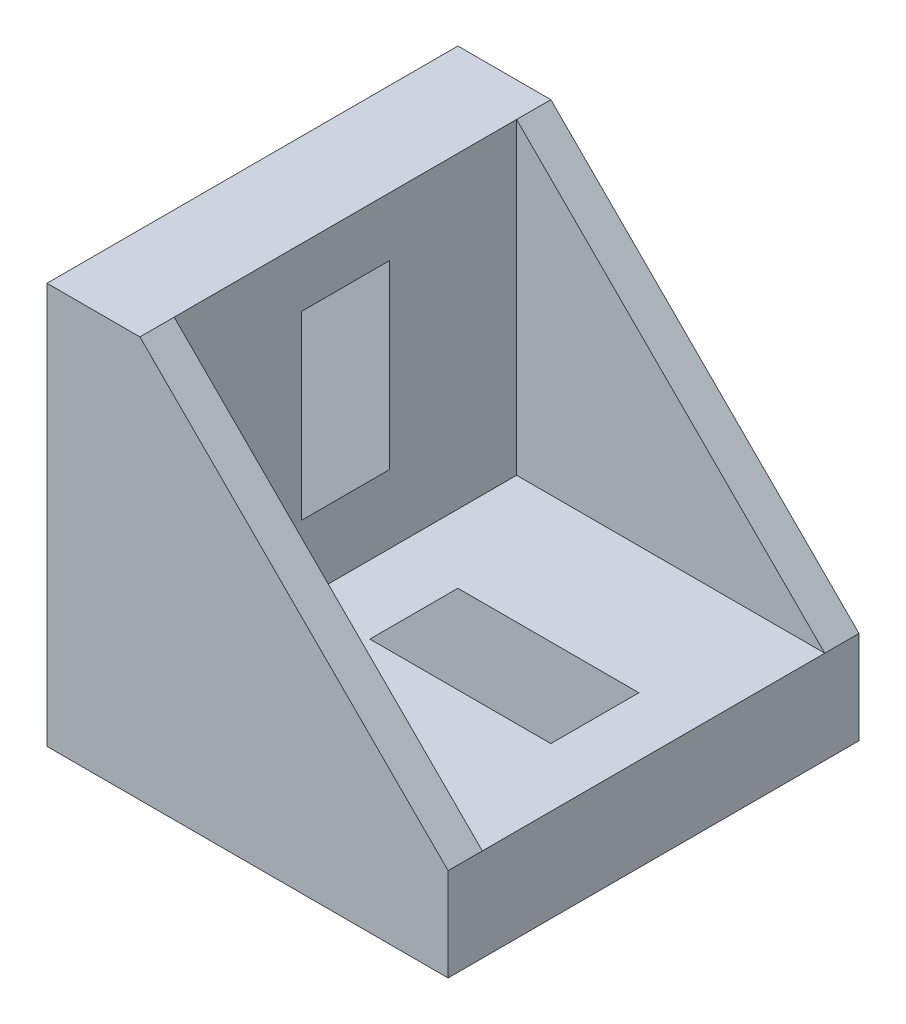
ISO-10303-21;
HEADER;
FILE_DESCRIPTION(('STEP AP214'),'2;1');
FILE_NAME('part.step','',(''),(''),'','','');
FILE_SCHEMA(('AUTOMOTIVE_DESIGN { 1 0 10303 214 1 1 1 1 }'));
ENDSEC;
DATA;
#1=APPLICATION_CONTEXT('core data for automotive mechanical design processes');
#2=APPLICATION_PROTOCOL_DEFINITION('international standard','automotive_design',2000,#1);
#3=PRODUCT_CONTEXT('',#1,'mechanical');
#4=PRODUCT('Part','Part','',(#3));
#5=PRODUCT_RELATED_PRODUCT_CATEGORY('part','',(#4));
#6=PRODUCT_DEFINITION_FORMATION('','',#4);
#7=PRODUCT_DEFINITION_CONTEXT('part definition',#1,'design');
#8=PRODUCT_DEFINITION('design','',#6,#7);
#9=PRODUCT_DEFINITION_SHAPE('','',#8);
#10=(LENGTH_UNIT() NAMED_UNIT(*) SI_UNIT(.MILLI.,.METRE.));
#11=(NAMED_UNIT(*) PLANE_ANGLE_UNIT() SI_UNIT($,.RADIAN.));
#12=(NAMED_UNIT(*) SI_UNIT($,.STERADIAN.) SOLID_ANGLE_UNIT());
#13=UNCERTAINTY_MEASURE_WITH_UNIT(LENGTH_MEASURE(1.E-05),#10,'distance_accuracy_value','');
#14=(GEOMETRIC_REPRESENTATION_CONTEXT(3) GLOBAL_UNCERTAINTY_ASSIGNED_CONTEXT((#13)) GLOBAL_UNIT_ASSIGNED_CONTEXT((#10,
#11,#12)) REPRESENTATION_CONTEXT('',''));
#15=CARTESIAN_POINT('',(0.,0.,0.));
#16=DIRECTION('',(0.,0.,1.));
#17=DIRECTION('',(1.,0.,0.));
#18=AXIS2_PLACEMENT_3D('',#15,#16,#17);
#19=CARTESIAN_POINT('',(0.,0.,21.));
#20=DIRECTION('',(1.,0.,0.));
#21=DIRECTION('',(0.,0.,-1.));
#22=AXIS2_PLACEMENT_3D('',#19,#20,#21);
#23=PLANE('',#22);
#24=DIRECTION('',(0.,0.,-1.));
#25=VECTOR('',#24,1.);
#26=CARTESIAN_POINT('',(0.,40.3,5.));
#27=LINE('',#26,#25);
#28=CARTESIAN_POINT('',(0.,40.3,5.));
#29=VERTEX_POINT('',#28);
#30=CARTESIAN_POINT('',(0.,40.3,-5.));
#31=VERTEX_POINT('',#30);
#32=EDGE_CURVE('E290',#29,#31,#27,.T.);
#33=ORIENTED_EDGE('',*,*,#32,.F.);
#34=DIRECTION('',(0.,1.,0.));
#35=VECTOR('',#34,1.);
#36=CARTESIAN_POINT('',(0.,40.3,5.));
#37=LINE('',#36,#35);
#38=CARTESIAN_POINT('',(0.,37.9992165715513,5.));
#39=VERTEX_POINT('',#38);
#40=EDGE_CURVE('E287',#39,#29,#37,.T.);
#41=ORIENTED_EDGE('',*,*,#40,.F.);
#42=DIRECTION('',(0.,0.,-1.));
#43=VECTOR('',#42,1.);
#44=CARTESIAN_POINT('',(0.,37.9992165715513,5.));
#45=LINE('',#44,#43);
#46=CARTESIAN_POINT('',(0.,37.9992165715513,-5.));
#47=VERTEX_POINT('',#46);
#48=EDGE_CURVE('E301',#39,#47,#45,.T.);
#49=ORIENTED_EDGE('',*,*,#48,.T.);
#50=DIRECTION('',(0.,1.,0.));
#51=VECTOR('',#50,1.);
#52=CARTESIAN_POINT('',(0.,40.3,-5.));
#53=LINE('',#52,#51);
#54=EDGE_CURVE('E282',#47,#31,#53,.T.);
#55=ORIENTED_EDGE('',*,*,#54,.T.);
#56=EDGE_LOOP('',(#33,#41,#49,#55));
#57=FACE_BOUND('',#56,.T.);
#58=DIRECTION('',(0.,-1.,0.));
#59=VECTOR('',#58,1.);
#60=CARTESIAN_POINT('',(0.,35.,-4.5));
#61=LINE('',#60,#59);
#62=CARTESIAN_POINT('',(0.,35.,-4.5));
#63=VERTEX_POINT('',#62);
#64=CARTESIAN_POINT('',(0.,7.,-4.5));
#65=VERTEX_POINT('',#64);
#66=EDGE_CURVE('E404',#63,#65,#61,.T.);
#67=ORIENTED_EDGE('',*,*,#66,.F.);
#68=DIRECTION('',(0.,0.,1.));
#69=VECTOR('',#68,1.);
#70=CARTESIAN_POINT('',(0.,35.,-4.5));
#71=LINE('',#70,#69);
#72=CARTESIAN_POINT('',(0.,35.,4.5));
#73=VERTEX_POINT('',#72);
#74=EDGE_CURVE('E427',#63,#73,#71,.T.);
#75=ORIENTED_EDGE('',*,*,#74,.T.);
#76=DIRECTION('',(0.,-1.,0.));
#77=VECTOR('',#76,1.);
#78=CARTESIAN_POINT('',(0.,35.,4.5));
#79=LINE('',#78,#77);
#80=CARTESIAN_POINT('',(0.,7.,4.5));
#81=VERTEX_POINT('',#80);
#82=EDGE_CURVE('E395',#73,#81,#79,.T.);
#83=ORIENTED_EDGE('',*,*,#82,.T.);
#84=DIRECTION('',(0.,0.,1.));
#85=VECTOR('',#84,1.);
#86=CARTESIAN_POINT('',(0.,7.,-4.5));
#87=LINE('',#86,#85);
#88=EDGE_CURVE('E416',#65,#81,#87,.T.);
#89=ORIENTED_EDGE('',*,*,#88,.F.);
#90=EDGE_LOOP('',(#67,#75,#83,#89));
#91=FACE_BOUND('',#90,.T.);
#92=DIRECTION('',(0.,-1.,0.));
#93=VECTOR('',#92,1.);
#94=CARTESIAN_POINT('',(0.,0.,-21.));
#95=LINE('',#94,#93);
#96=CARTESIAN_POINT('',(0.,41.,-21.));
#97=VERTEX_POINT('',#96);
#98=CARTESIAN_POINT('',(0.,0.,-21.));
#99=VERTEX_POINT('',#98);
#100=EDGE_CURVE('E467',#97,#99,#95,.T.);
#101=ORIENTED_EDGE('',*,*,#100,.T.);
#102=DIRECTION('',(0.,0.,-1.));
#103=VECTOR('',#102,1.);
#104=CARTESIAN_POINT('',(0.,0.,21.));
#105=LINE('',#104,#103);
#106=CARTESIAN_POINT('',(0.,0.,21.));
#107=VERTEX_POINT('',#106);
#108=EDGE_CURVE('E475',#107,#99,#105,.T.);
#109=ORIENTED_EDGE('',*,*,#108,.F.);
#110=DIRECTION('',(0.,-1.,0.));
#111=VECTOR('',#110,1.);
#112=CARTESIAN_POINT('',(0.,0.,21.));
#113=LINE('',#112,#111);
#114=CARTESIAN_POINT('',(0.,41.,21.));
#115=VERTEX_POINT('',#114);
#116=EDGE_CURVE('E473',#115,#107,#113,.T.);
#117=ORIENTED_EDGE('',*,*,#116,.F.);
#118=DIRECTION('',(0.,0.,-1.));
#119=VECTOR('',#118,1.);
#120=CARTESIAN_POINT('',(0.,41.,21.));
#121=LINE('',#120,#119);
#122=EDGE_CURVE('E489',#115,#97,#121,.T.);
#123=ORIENTED_EDGE('',*,*,#122,.T.);
#124=EDGE_LOOP('',(#101,#109,#117,#123));
#125=FACE_BOUND('',#124,.T.);
#126=DIRECTION('',(0.,1.,0.));
#127=VECTOR('',#126,1.);
#128=CARTESIAN_POINT('',(0.,1.23475047748402,5.));
#129=LINE('',#128,#127);
#130=CARTESIAN_POINT('',(0.,1.23475047748402,5.));
#131=VERTEX_POINT('',#130);
#132=CARTESIAN_POINT('',(0.,3.53553390593273,5.));
#133=VERTEX_POINT('',#132);
#134=EDGE_CURVE('E310',#131,#133,#129,.T.);
#135=ORIENTED_EDGE('',*,*,#134,.F.);
#136=DIRECTION('',(0.,0.,-1.));
#137=VECTOR('',#136,1.);
#138=CARTESIAN_POINT('',(0.,1.23475047748402,5.));
#139=LINE('',#138,#137);
#140=CARTESIAN_POINT('',(0.,1.23475047748402,-5.));
#141=VERTEX_POINT('',#140);
#142=EDGE_CURVE('E320',#131,#141,#139,.T.);
#143=ORIENTED_EDGE('',*,*,#142,.T.);
#144=DIRECTION('',(0.,1.,0.));
#145=VECTOR('',#144,1.);
#146=CARTESIAN_POINT('',(0.,1.23475047748402,-5.));
#147=LINE('',#146,#145);
#148=CARTESIAN_POINT('',(0.,3.53553390593273,-5.));
#149=VERTEX_POINT('',#148);
#150=EDGE_CURVE('E309',#141,#149,#147,.T.);
#151=ORIENTED_EDGE('',*,*,#150,.T.);
#152=DIRECTION('',(0.,0.,-1.));
#153=VECTOR('',#152,1.);
#154=CARTESIAN_POINT('',(0.,3.53553390593273,5.));
#155=LINE('',#154,#153);
#156=EDGE_CURVE('E336',#133,#149,#155,.T.);
#157=ORIENTED_EDGE('',*,*,#156,.F.);
#158=EDGE_LOOP('',(#135,#143,#151,#157));
#159=FACE_BOUND('',#158,.T.);
#160=ADVANCED_FACE('F34',(#57,#91,#125,#159),#23,.F.);
#161=CARTESIAN_POINT('',(41.,0.,21.));
#162=DIRECTION('',(0.,1.,0.));
#163=DIRECTION('',(-1.,0.,0.));
#164=AXIS2_PLACEMENT_3D('',#161,#162,#163);
#165=PLANE('',#164);
#166=DIRECTION('',(0.,0.,-1.));
#167=VECTOR('',#166,1.);
#168=CARTESIAN_POINT('',(37.9992165715513,0.,5.));
#169=LINE('',#168,#167);
#170=CARTESIAN_POINT('',(37.9992165715513,0.,5.));
#171=VERTEX_POINT('',#170);
#172=CARTESIAN_POINT('',(37.9992165715513,0.,-5.));
#173=VERTEX_POINT('',#172);
#174=EDGE_CURVE('E49',#171,#173,#169,.T.);
#175=ORIENTED_EDGE('',*,*,#174,.F.);
#176=DIRECTION('',(-1.,0.,0.));
#177=VECTOR('',#176,1.);
#178=CARTESIAN_POINT('',(40.3,0.,5.));
#179=LINE('',#178,#177);
#180=CARTESIAN_POINT('',(40.3,0.,5.));
#181=VERTEX_POINT('',#180);
#182=EDGE_CURVE('E54',#181,#171,#179,.T.);
#183=ORIENTED_EDGE('',*,*,#182,.F.);
#184=DIRECTION('',(0.,0.,-1.));
#185=VECTOR('',#184,1.);
#186=CARTESIAN_POINT('',(40.3,0.,5.));
#187=LINE('',#186,#185);
#188=CARTESIAN_POINT('',(40.3,0.,-5.));
#189=VERTEX_POINT('',#188);
#190=EDGE_CURVE('E262',#181,#189,#187,.T.);
#191=ORIENTED_EDGE('',*,*,#190,.T.);
#192=DIRECTION('',(-1.,0.,0.));
#193=VECTOR('',#192,1.);
#194=CARTESIAN_POINT('',(40.3,0.,-5.));
#195=LINE('',#194,#193);
#196=EDGE_CURVE('E266',#189,#173,#195,.T.);
#197=ORIENTED_EDGE('',*,*,#196,.T.);
#198=EDGE_LOOP('',(#175,#183,#191,#197));
#199=FACE_BOUND('',#198,.T.);
#200=DIRECTION('',(1.,0.,0.));
#201=VECTOR('',#200,1.);
#202=CARTESIAN_POINT('',(7.,0.,-4.5));
#203=LINE('',#202,#201);
#204=CARTESIAN_POINT('',(7.,0.,-4.5));
#205=VERTEX_POINT('',#204);
#206=CARTESIAN_POINT('',(35.,0.,-4.5));
#207=VERTEX_POINT('',#206);
#208=EDGE_CURVE('E372',#205,#207,#203,.T.);
#209=ORIENTED_EDGE('',*,*,#208,.F.);
#210=DIRECTION('',(0.,0.,1.));
#211=VECTOR('',#210,1.);
#212=CARTESIAN_POINT('',(7.,0.,-4.5));
#213=LINE('',#212,#211);
#214=CARTESIAN_POINT('',(7.,0.,4.5));
#215=VERTEX_POINT('',#214);
#216=EDGE_CURVE('E382',#205,#215,#213,.T.);
#217=ORIENTED_EDGE('',*,*,#216,.T.);
#218=DIRECTION('',(1.,0.,0.));
#219=VECTOR('',#218,1.);
#220=CARTESIAN_POINT('',(7.,0.,4.5));
#221=LINE('',#220,#219);
#222=CARTESIAN_POINT('',(35.,0.,4.5));
#223=VERTEX_POINT('',#222);
#224=EDGE_CURVE('E385',#215,#223,#221,.T.);
#225=ORIENTED_EDGE('',*,*,#224,.T.);
#226=DIRECTION('',(0.,0.,1.));
#227=VECTOR('',#226,1.);
#228=CARTESIAN_POINT('',(35.,0.,-4.5));
#229=LINE('',#228,#227);
#230=EDGE_CURVE('E399',#207,#223,#229,.T.);
#231=ORIENTED_EDGE('',*,*,#230,.F.);
#232=EDGE_LOOP('',(#209,#217,#225,#231));
#233=FACE_BOUND('',#232,.T.);
#234=DIRECTION('',(1.,0.,0.));
#235=VECTOR('',#234,1.);
#236=CARTESIAN_POINT('',(41.,0.,-21.));
#237=LINE('',#236,#235);
#238=CARTESIAN_POINT('',(41.,0.,-21.));
#239=VERTEX_POINT('',#238);
#240=EDGE_CURVE('E459',#99,#239,#237,.T.);
#241=ORIENTED_EDGE('',*,*,#240,.T.);
#242=DIRECTION('',(0.,0.,-1.));
#243=VECTOR('',#242,1.);
#244=CARTESIAN_POINT('',(41.,0.,21.));
#245=LINE('',#244,#243);
#246=CARTESIAN_POINT('',(41.,0.,21.));
#247=VERTEX_POINT('',#246);
#248=EDGE_CURVE('E11',#247,#239,#245,.T.);
#249=ORIENTED_EDGE('',*,*,#248,.F.);
#250=DIRECTION('',(1.,0.,0.));
#251=VECTOR('',#250,1.);
#252=CARTESIAN_POINT('',(41.,0.,21.));
#253=LINE('',#252,#251);
#254=EDGE_CURVE('E463',#107,#247,#253,.T.);
#255=ORIENTED_EDGE('',*,*,#254,.F.);
#256=ORIENTED_EDGE('',*,*,#108,.T.);
#257=EDGE_LOOP('',(#241,#249,#255,#256));
#258=FACE_BOUND('',#257,.T.);
#259=DIRECTION('',(-1.,0.,0.));
#260=VECTOR('',#259,1.);
#261=CARTESIAN_POINT('',(1.23475047748401,0.,5.));
#262=LINE('',#261,#260);
#263=CARTESIAN_POINT('',(3.53553390593274,0.,5.));
#264=VERTEX_POINT('',#263);
#265=CARTESIAN_POINT('',(1.23475047748401,0.,5.));
#266=VERTEX_POINT('',#265);
#267=EDGE_CURVE('E341',#264,#266,#262,.T.);
#268=ORIENTED_EDGE('',*,*,#267,.F.);
#269=DIRECTION('',(0.,0.,-1.));
#270=VECTOR('',#269,1.);
#271=CARTESIAN_POINT('',(3.53553390593274,0.,5.));
#272=LINE('',#271,#270);
#273=CARTESIAN_POINT('',(3.53553390593274,0.,-5.));
#274=VERTEX_POINT('',#273);
#275=EDGE_CURVE('E365',#264,#274,#272,.T.);
#276=ORIENTED_EDGE('',*,*,#275,.T.);
#277=DIRECTION('',(-1.,0.,0.));
#278=VECTOR('',#277,1.);
#279=CARTESIAN_POINT('',(1.23475047748401,0.,-5.));
#280=LINE('',#279,#278);
#281=CARTESIAN_POINT('',(1.234750477484,0.,-5.));
#282=VERTEX_POINT('',#281);
#283=EDGE_CURVE('E351',#274,#282,#280,.T.);
#284=ORIENTED_EDGE('',*,*,#283,.T.);
#285=DIRECTION('',(0.,0.,-1.));
#286=VECTOR('',#285,1.);
#287=CARTESIAN_POINT('',(1.23475047748401,0.,5.));
#288=LINE('',#287,#286);
#289=EDGE_CURVE('E362',#266,#282,#288,.T.);
#290=ORIENTED_EDGE('',*,*,#289,.F.);
#291=EDGE_LOOP('',(#268,#276,#284,#290));
#292=FACE_BOUND('',#291,.T.);
#293=ADVANCED_FACE('F36',(#199,#233,#258,#292),#165,.F.);
#294=CARTESIAN_POINT('',(9.5,9.5,-17.5));
#295=DIRECTION('',(0.,-1.,0.));
#296=DIRECTION('',(0.,0.,-1.));
#297=AXIS2_PLACEMENT_3D('',#294,#295,#296);
#298=PLANE('',#297);
#299=DIRECTION('',(1.,0.,0.));
#300=VECTOR('',#299,1.);
#301=CARTESIAN_POINT('',(9.5,9.5,17.5));
#302=LINE('',#301,#300);
#303=CARTESIAN_POINT('',(9.5,9.5,17.5));
#304=VERTEX_POINT('',#303);
#305=CARTESIAN_POINT('',(41.,9.5,17.5));
#306=VERTEX_POINT('',#305);
#307=EDGE_CURVE('E442',#304,#306,#302,.T.);
#308=ORIENTED_EDGE('',*,*,#307,.T.);
#309=DIRECTION('',(0.,0.,1.));
#310=VECTOR('',#309,1.);
#311=CARTESIAN_POINT('',(41.,9.5,-17.5));
#312=LINE('',#311,#310);
#313=CARTESIAN_POINT('',(41.,9.5,-17.5));
#314=VERTEX_POINT('',#313);
#315=EDGE_CURVE('E456',#314,#306,#312,.T.);
#316=ORIENTED_EDGE('',*,*,#315,.F.);
#317=DIRECTION('',(1.,0.,0.));
#318=VECTOR('',#317,1.);
#319=CARTESIAN_POINT('',(9.5,9.5,-17.5));
#320=LINE('',#319,#318);
#321=CARTESIAN_POINT('',(9.5,9.5,-17.5));
#322=VERTEX_POINT('',#321);
#323=EDGE_CURVE('E445',#322,#314,#320,.T.);
#324=ORIENTED_EDGE('',*,*,#323,.F.);
#325=DIRECTION('',(0.,0.,1.));
#326=VECTOR('',#325,1.);
#327=CARTESIAN_POINT('',(9.5,9.5,-17.5));
#328=LINE('',#327,#326);
#329=EDGE_CURVE('E460',#322,#304,#328,.T.);
#330=ORIENTED_EDGE('',*,*,#329,.T.);
#331=EDGE_LOOP('',(#308,#316,#324,#330));
#332=FACE_BOUND('',#331,.T.);
#333=DIRECTION('',(-1.,0.,0.));
#334=VECTOR('',#333,1.);
#335=CARTESIAN_POINT('',(16.5,9.5,-4.5));
#336=LINE('',#335,#334);
#337=CARTESIAN_POINT('',(35.,9.5,-4.5));
#338=VERTEX_POINT('',#337);
#339=CARTESIAN_POINT('',(16.5,9.5,-4.5));
#340=VERTEX_POINT('',#339);
#341=EDGE_CURVE('E379',#338,#340,#336,.T.);
#342=ORIENTED_EDGE('',*,*,#341,.F.);
#343=DIRECTION('',(0.,0.,1.));
#344=VECTOR('',#343,1.);
#345=CARTESIAN_POINT('',(35.,9.5,-4.5));
#346=LINE('',#345,#344);
#347=CARTESIAN_POINT('',(35.,9.5,4.5));
#348=VERTEX_POINT('',#347);
#349=EDGE_CURVE('E396',#338,#348,#346,.T.);
#350=ORIENTED_EDGE('',*,*,#349,.T.);
#351=DIRECTION('',(-1.,0.,0.));
#352=VECTOR('',#351,1.);
#353=CARTESIAN_POINT('',(16.5,9.5,4.5));
#354=LINE('',#353,#352);
#355=CARTESIAN_POINT('',(16.5,9.5,4.5));
#356=VERTEX_POINT('',#355);
#357=EDGE_CURVE('E373',#348,#356,#354,.T.);
#358=ORIENTED_EDGE('',*,*,#357,.T.);
#359=DIRECTION('',(0.,0.,1.));
#360=VECTOR('',#359,1.);
#361=CARTESIAN_POINT('',(16.5,9.5,-4.5));
#362=LINE('',#361,#360);
#363=EDGE_CURVE('E392',#340,#356,#362,.T.);
#364=ORIENTED_EDGE('',*,*,#363,.F.);
#365=EDGE_LOOP('',(#342,#350,#358,#364));
#366=FACE_BOUND('',#365,.T.);
#367=ADVANCED_FACE('F533',(#332,#366),#298,.F.);
#368=CARTESIAN_POINT('',(9.5,41.,-17.5));
#369=DIRECTION('',(-1.,0.,0.));
#370=DIRECTION('',(0.,-1.,0.));
#371=AXIS2_PLACEMENT_3D('',#368,#369,#370);
#372=PLANE('',#371);
#373=DIRECTION('',(0.,-1.,0.));
#374=VECTOR('',#373,1.);
#375=CARTESIAN_POINT('',(9.5,41.,17.5));
#376=LINE('',#375,#374);
#377=CARTESIAN_POINT('',(9.5,41.,17.5));
#378=VERTEX_POINT('',#377);
#379=EDGE_CURVE('E451',#378,#304,#376,.T.);
#380=ORIENTED_EDGE('',*,*,#379,.T.);
#381=ORIENTED_EDGE('',*,*,#329,.F.);
#382=DIRECTION('',(0.,-1.,0.));
#383=VECTOR('',#382,1.);
#384=CARTESIAN_POINT('',(9.5,41.,-17.5));
#385=LINE('',#384,#383);
#386=CARTESIAN_POINT('',(9.5,41.,-17.5));
#387=VERTEX_POINT('',#386);
#388=EDGE_CURVE('E441',#387,#322,#385,.T.);
#389=ORIENTED_EDGE('',*,*,#388,.F.);
#390=DIRECTION('',(0.,0.,1.));
#391=VECTOR('',#390,1.);
#392=CARTESIAN_POINT('',(9.5,41.,-17.5));
#393=LINE('',#392,#391);
#394=EDGE_CURVE('E448',#387,#378,#393,.T.);
#395=ORIENTED_EDGE('',*,*,#394,.T.);
#396=EDGE_LOOP('',(#380,#381,#389,#395));
#397=FACE_BOUND('',#396,.T.);
#398=DIRECTION('',(0.,1.,0.));
#399=VECTOR('',#398,1.);
#400=CARTESIAN_POINT('',(9.5,35.,-4.5));
#401=LINE('',#400,#399);
#402=CARTESIAN_POINT('',(9.5,16.5,-4.5));
#403=VERTEX_POINT('',#402);
#404=CARTESIAN_POINT('',(9.5,35.,-4.5));
#405=VERTEX_POINT('',#404);
#406=EDGE_CURVE('E411',#403,#405,#401,.T.);
#407=ORIENTED_EDGE('',*,*,#406,.F.);
#408=DIRECTION('',(0.,0.,1.));
#409=VECTOR('',#408,1.);
#410=CARTESIAN_POINT('',(9.5,16.5,-4.5));
#411=LINE('',#410,#409);
#412=CARTESIAN_POINT('',(9.5,16.5,4.5));
#413=VERTEX_POINT('',#412);
#414=EDGE_CURVE('E434',#403,#413,#411,.T.);
#415=ORIENTED_EDGE('',*,*,#414,.T.);
#416=DIRECTION('',(0.,1.,0.));
#417=VECTOR('',#416,1.);
#418=CARTESIAN_POINT('',(9.5,35.,4.5));
#419=LINE('',#418,#417);
#420=CARTESIAN_POINT('',(9.5,35.,4.5));
#421=VERTEX_POINT('',#420);
#422=EDGE_CURVE('E422',#413,#421,#419,.T.);
#423=ORIENTED_EDGE('',*,*,#422,.T.);
#424=DIRECTION('',(0.,0.,1.));
#425=VECTOR('',#424,1.);
#426=CARTESIAN_POINT('',(9.5,35.,-4.5));
#427=LINE('',#426,#425);
#428=EDGE_CURVE('E431',#405,#421,#427,.T.);
#429=ORIENTED_EDGE('',*,*,#428,.F.);
#430=EDGE_LOOP('',(#407,#415,#423,#429));
#431=FACE_BOUND('',#430,.T.);
#432=ADVANCED_FACE('F538',(#397,#431),#372,.F.);
#433=CARTESIAN_POINT('',(41.,9.5,21.));
#434=DIRECTION('',(-0.707106781186547,-0.707106781186547,0.));
#435=DIRECTION('',(0.707106781186548,-0.707106781186548,0.));
#436=AXIS2_PLACEMENT_3D('',#433,#434,#435);
#437=PLANE('',#436);
#438=DIRECTION('',(-0.707106781186547,0.707106781186547,0.));
#439=VECTOR('',#438,1.);
#440=CARTESIAN_POINT('',(9.5,41.,-17.5));
#441=LINE('',#440,#439);
#442=EDGE_CURVE('E439',#314,#387,#441,.T.);
#443=ORIENTED_EDGE('',*,*,#442,.F.);
#444=DIRECTION('',(0.,0.,-1.));
#445=VECTOR('',#444,1.);
#446=CARTESIAN_POINT('',(41.,9.5,21.));
#447=LINE('',#446,#445);
#448=CARTESIAN_POINT('',(41.,9.5,-21.));
#449=VERTEX_POINT('',#448);
#450=EDGE_CURVE('E495',#314,#449,#447,.T.);
#451=ORIENTED_EDGE('',*,*,#450,.T.);
#452=DIRECTION('',(-0.707106781186547,0.707106781186547,0.));
#453=VECTOR('',#452,1.);
#454=CARTESIAN_POINT('',(41.,9.5,-21.));
#455=LINE('',#454,#453);
#456=CARTESIAN_POINT('',(9.5,41.,-21.));
#457=VERTEX_POINT('',#456);
#458=EDGE_CURVE('E481',#449,#457,#455,.T.);
#459=ORIENTED_EDGE('',*,*,#458,.T.);
#460=DIRECTION('',(0.,0.,-1.));
#461=VECTOR('',#460,1.);
#462=CARTESIAN_POINT('',(9.5,41.,21.));
#463=LINE('',#462,#461);
#464=EDGE_CURVE('E492',#387,#457,#463,.T.);
#465=ORIENTED_EDGE('',*,*,#464,.F.);
#466=EDGE_LOOP('',(#443,#451,#459,#465));
#467=FACE_BOUND('',#466,.T.);
#468=ADVANCED_FACE('F503',(#467),#437,.F.);
#469=CARTESIAN_POINT('',(41.,9.5,21.));
#470=DIRECTION('',(-1.,0.,0.));
#471=DIRECTION('',(0.,0.,1.));
#472=AXIS2_PLACEMENT_3D('',#469,#470,#471);
#473=PLANE('',#472);
#474=DIRECTION('',(0.,1.,0.));
#475=VECTOR('',#474,1.);
#476=CARTESIAN_POINT('',(41.,9.5,-21.));
#477=LINE('',#476,#475);
#478=EDGE_CURVE('E478',#239,#449,#477,.T.);
#479=ORIENTED_EDGE('',*,*,#478,.T.);
#480=ORIENTED_EDGE('',*,*,#450,.F.);
#481=ORIENTED_EDGE('',*,*,#315,.T.);
#482=CARTESIAN_POINT('',(41.,9.5,21.));
#483=VERTEX_POINT('',#482);
#484=EDGE_CURVE('E42',#483,#306,#447,.T.);
#485=ORIENTED_EDGE('',*,*,#484,.F.);
#486=DIRECTION('',(0.,1.,0.));
#487=VECTOR('',#486,1.);
#488=CARTESIAN_POINT('',(41.,9.5,21.));
#489=LINE('',#488,#487);
#490=EDGE_CURVE('E466',#247,#483,#489,.T.);
#491=ORIENTED_EDGE('',*,*,#490,.F.);
#492=ORIENTED_EDGE('',*,*,#248,.T.);
#493=EDGE_LOOP('',(#479,#480,#481,#485,#491,#492));
#494=FACE_BOUND('',#493,.T.);
#495=ADVANCED_FACE('F508',(#494),#473,.F.);
#496=ORIENTED_EDGE('',*,*,#484,.T.);
#497=DIRECTION('',(-0.707106781186547,0.707106781186547,0.));
#498=VECTOR('',#497,1.);
#499=CARTESIAN_POINT('',(9.5,41.,17.5));
#500=LINE('',#499,#498);
#501=EDGE_CURVE('E430',#306,#378,#500,.T.);
#502=ORIENTED_EDGE('',*,*,#501,.T.);
#503=CARTESIAN_POINT('',(9.5,41.,21.));
#504=VERTEX_POINT('',#503);
#505=EDGE_CURVE('E493',#504,#378,#463,.T.);
#506=ORIENTED_EDGE('',*,*,#505,.F.);
#507=DIRECTION('',(-0.707106781186547,0.707106781186547,0.));
#508=VECTOR('',#507,1.);
#509=CARTESIAN_POINT('',(41.,9.5,21.));
#510=LINE('',#509,#508);
#511=EDGE_CURVE('E469',#483,#504,#510,.T.);
#512=ORIENTED_EDGE('',*,*,#511,.F.);
#513=EDGE_LOOP('',(#496,#502,#506,#512));
#514=FACE_BOUND('',#513,.T.);
#515=ADVANCED_FACE('F527',(#514),#437,.F.);
#516=CARTESIAN_POINT('',(9.5,41.,21.));
#517=DIRECTION('',(0.,-1.,0.));
#518=DIRECTION('',(0.,0.,-1.));
#519=AXIS2_PLACEMENT_3D('',#516,#517,#518);
#520=PLANE('',#519);
#521=DIRECTION('',(-1.,0.,0.));
#522=VECTOR('',#521,1.);
#523=CARTESIAN_POINT('',(9.5,41.,-21.));
#524=LINE('',#523,#522);
#525=EDGE_CURVE('E484',#457,#97,#524,.T.);
#526=ORIENTED_EDGE('',*,*,#525,.T.);
#527=ORIENTED_EDGE('',*,*,#122,.F.);
#528=DIRECTION('',(-1.,0.,0.));
#529=VECTOR('',#528,1.);
#530=CARTESIAN_POINT('',(9.5,41.,21.));
#531=LINE('',#530,#529);
#532=EDGE_CURVE('E471',#504,#115,#531,.T.);
#533=ORIENTED_EDGE('',*,*,#532,.F.);
#534=ORIENTED_EDGE('',*,*,#505,.T.);
#535=ORIENTED_EDGE('',*,*,#394,.F.);
#536=ORIENTED_EDGE('',*,*,#464,.T.);
#537=EDGE_LOOP('',(#526,#527,#533,#534,#535,#536));
#538=FACE_BOUND('',#537,.T.);
#539=ADVANCED_FACE('F516',(#538),#520,.F.);
#540=CARTESIAN_POINT('',(0.,0.,21.));
#541=DIRECTION('',(0.,0.,-1.));
#542=DIRECTION('',(-1.,0.,0.));
#543=AXIS2_PLACEMENT_3D('',#540,#541,#542);
#544=PLANE('',#543);
#545=ORIENTED_EDGE('',*,*,#254,.T.);
#546=ORIENTED_EDGE('',*,*,#490,.T.);
#547=ORIENTED_EDGE('',*,*,#511,.T.);
#548=ORIENTED_EDGE('',*,*,#532,.T.);
#549=ORIENTED_EDGE('',*,*,#116,.T.);
#550=EDGE_LOOP('',(#545,#546,#547,#548,#549));
#551=FACE_BOUND('',#550,.T.);
#552=ADVANCED_FACE('F525',(#551),#544,.F.);
#553=CARTESIAN_POINT('',(0.,0.,-21.));
#554=DIRECTION('',(0.,0.,-1.));
#555=DIRECTION('',(-1.,0.,0.));
#556=AXIS2_PLACEMENT_3D('',#553,#554,#555);
#557=PLANE('',#556);
#558=ORIENTED_EDGE('',*,*,#240,.F.);
#559=ORIENTED_EDGE('',*,*,#100,.F.);
#560=ORIENTED_EDGE('',*,*,#525,.F.);
#561=ORIENTED_EDGE('',*,*,#458,.F.);
#562=ORIENTED_EDGE('',*,*,#478,.F.);
#563=EDGE_LOOP('',(#558,#559,#560,#561,#562));
#564=FACE_BOUND('',#563,.T.);
#565=ADVANCED_FACE('F512',(#564),#557,.T.);
#566=CARTESIAN_POINT('',(41.,9.5,-17.5));
#567=DIRECTION('',(0.,0.,1.));
#568=DIRECTION('',(1.,0.,0.));
#569=AXIS2_PLACEMENT_3D('',#566,#567,#568);
#570=PLANE('',#569);
#571=ORIENTED_EDGE('',*,*,#442,.T.);
#572=ORIENTED_EDGE('',*,*,#388,.T.);
#573=ORIENTED_EDGE('',*,*,#323,.T.);
#574=EDGE_LOOP('',(#571,#572,#573));
#575=FACE_BOUND('',#574,.T.);
#576=ADVANCED_FACE('F541',(#575),#570,.T.);
#577=CARTESIAN_POINT('',(41.,9.5,17.5));
#578=DIRECTION('',(0.,0.,1.));
#579=DIRECTION('',(1.,0.,0.));
#580=AXIS2_PLACEMENT_3D('',#577,#578,#579);
#581=PLANE('',#580);
#582=ORIENTED_EDGE('',*,*,#501,.F.);
#583=ORIENTED_EDGE('',*,*,#307,.F.);
#584=ORIENTED_EDGE('',*,*,#379,.F.);
#585=EDGE_LOOP('',(#582,#583,#584));
#586=FACE_BOUND('',#585,.T.);
#587=ADVANCED_FACE('F531',(#586),#581,.F.);
#588=CARTESIAN_POINT('',(0.,35.,-4.5));
#589=DIRECTION('',(0.,1.,0.));
#590=DIRECTION('',(0.,0.,1.));
#591=AXIS2_PLACEMENT_3D('',#588,#589,#590);
#592=PLANE('',#591);
#593=DIRECTION('',(-1.,0.,0.));
#594=VECTOR('',#593,1.);
#595=CARTESIAN_POINT('',(0.,35.,4.5));
#596=LINE('',#595,#594);
#597=EDGE_CURVE('E408',#421,#73,#596,.T.);
#598=ORIENTED_EDGE('',*,*,#597,.T.);
#599=ORIENTED_EDGE('',*,*,#74,.F.);
#600=DIRECTION('',(-1.,0.,0.));
#601=VECTOR('',#600,1.);
#602=CARTESIAN_POINT('',(0.,35.,-4.5));
#603=LINE('',#602,#601);
#604=EDGE_CURVE('E413',#405,#63,#603,.T.);
#605=ORIENTED_EDGE('',*,*,#604,.F.);
#606=ORIENTED_EDGE('',*,*,#428,.T.);
#607=EDGE_LOOP('',(#598,#599,#605,#606));
#608=FACE_BOUND('',#607,.T.);
#609=ADVANCED_FACE('F548',(#608),#592,.F.);
#610=CARTESIAN_POINT('',(0.,7.,-4.5));
#611=DIRECTION('',(0.707106781186548,-0.707106781186547,0.));
#612=DIRECTION('',(0.707106781186547,0.707106781186548,0.));
#613=AXIS2_PLACEMENT_3D('',#610,#611,#612);
#614=PLANE('',#613);
#615=DIRECTION('',(0.707106781186547,0.707106781186548,0.));
#616=VECTOR('',#615,1.);
#617=CARTESIAN_POINT('',(0.,7.,4.5));
#618=LINE('',#617,#616);
#619=EDGE_CURVE('E419',#81,#413,#618,.T.);
#620=ORIENTED_EDGE('',*,*,#619,.T.);
#621=ORIENTED_EDGE('',*,*,#414,.F.);
#622=DIRECTION('',(0.707106781186547,0.707106781186548,0.));
#623=VECTOR('',#622,1.);
#624=CARTESIAN_POINT('',(0.,7.,-4.5));
#625=LINE('',#624,#623);
#626=EDGE_CURVE('E407',#65,#403,#625,.T.);
#627=ORIENTED_EDGE('',*,*,#626,.F.);
#628=ORIENTED_EDGE('',*,*,#88,.T.);
#629=EDGE_LOOP('',(#620,#621,#627,#628));
#630=FACE_BOUND('',#629,.T.);
#631=ADVANCED_FACE('F632',(#630),#614,.F.);
#632=CARTESIAN_POINT('',(0.,35.,-4.5));
#633=DIRECTION('',(0.,0.,1.));
#634=DIRECTION('',(1.,0.,0.));
#635=AXIS2_PLACEMENT_3D('',#632,#633,#634);
#636=PLANE('',#635);
#637=ORIENTED_EDGE('',*,*,#66,.T.);
#638=ORIENTED_EDGE('',*,*,#626,.T.);
#639=ORIENTED_EDGE('',*,*,#406,.T.);
#640=ORIENTED_EDGE('',*,*,#604,.T.);
#641=EDGE_LOOP('',(#637,#638,#639,#640));
#642=FACE_BOUND('',#641,.T.);
#643=ADVANCED_FACE('F642',(#642),#636,.T.);
#644=CARTESIAN_POINT('',(0.,35.,4.5));
#645=DIRECTION('',(0.,0.,1.));
#646=DIRECTION('',(1.,0.,0.));
#647=AXIS2_PLACEMENT_3D('',#644,#645,#646);
#648=PLANE('',#647);
#649=ORIENTED_EDGE('',*,*,#82,.F.);
#650=ORIENTED_EDGE('',*,*,#597,.F.);
#651=ORIENTED_EDGE('',*,*,#422,.F.);
#652=ORIENTED_EDGE('',*,*,#619,.F.);
#653=EDGE_LOOP('',(#649,#650,#651,#652));
#654=FACE_BOUND('',#653,.T.);
#655=ADVANCED_FACE('F651',(#654),#648,.F.);
#656=CARTESIAN_POINT('',(16.5,9.5,-4.5));
#657=DIRECTION('',(-0.707106781186547,0.707106781186548,0.));
#658=DIRECTION('',(-0.707106781186548,-0.707106781186547,0.));
#659=AXIS2_PLACEMENT_3D('',#656,#657,#658);
#660=PLANE('',#659);
#661=DIRECTION('',(-0.707106781186548,-0.707106781186547,0.));
#662=VECTOR('',#661,1.);
#663=CARTESIAN_POINT('',(16.5,9.5,4.5));
#664=LINE('',#663,#662);
#665=EDGE_CURVE('E368',#356,#215,#664,.T.);
#666=ORIENTED_EDGE('',*,*,#665,.T.);
#667=ORIENTED_EDGE('',*,*,#216,.F.);
#668=DIRECTION('',(-0.707106781186548,-0.707106781186547,0.));
#669=VECTOR('',#668,1.);
#670=CARTESIAN_POINT('',(16.5,9.5,-4.5));
#671=LINE('',#670,#669);
#672=EDGE_CURVE('E369',#340,#205,#671,.T.);
#673=ORIENTED_EDGE('',*,*,#672,.F.);
#674=ORIENTED_EDGE('',*,*,#363,.T.);
#675=EDGE_LOOP('',(#666,#667,#673,#674));
#676=FACE_BOUND('',#675,.T.);
#677=ADVANCED_FACE('F661',(#676),#660,.F.);
#678=CARTESIAN_POINT('',(35.,9.5,-4.5));
#679=DIRECTION('',(1.,0.,0.));
#680=DIRECTION('',(0.,0.,-1.));
#681=AXIS2_PLACEMENT_3D('',#678,#679,#680);
#682=PLANE('',#681);
#683=DIRECTION('',(0.,1.,0.));
#684=VECTOR('',#683,1.);
#685=CARTESIAN_POINT('',(35.,9.5,4.5));
#686=LINE('',#685,#684);
#687=EDGE_CURVE('E388',#223,#348,#686,.T.);
#688=ORIENTED_EDGE('',*,*,#687,.T.);
#689=ORIENTED_EDGE('',*,*,#349,.F.);
#690=DIRECTION('',(0.,1.,0.));
#691=VECTOR('',#690,1.);
#692=CARTESIAN_POINT('',(35.,9.5,-4.5));
#693=LINE('',#692,#691);
#694=EDGE_CURVE('E376',#207,#338,#693,.T.);
#695=ORIENTED_EDGE('',*,*,#694,.F.);
#696=ORIENTED_EDGE('',*,*,#230,.T.);
#697=EDGE_LOOP('',(#688,#689,#695,#696));
#698=FACE_BOUND('',#697,.T.);
#699=ADVANCED_FACE('F671',(#698),#682,.F.);
#700=CARTESIAN_POINT('',(7.,0.,-4.5));
#701=DIRECTION('',(0.,0.,1.));
#702=DIRECTION('',(1.,0.,0.));
#703=AXIS2_PLACEMENT_3D('',#700,#701,#702);
#704=PLANE('',#703);
#705=ORIENTED_EDGE('',*,*,#672,.T.);
#706=ORIENTED_EDGE('',*,*,#208,.T.);
#707=ORIENTED_EDGE('',*,*,#694,.T.);
#708=ORIENTED_EDGE('',*,*,#341,.T.);
#709=EDGE_LOOP('',(#705,#706,#707,#708));
#710=FACE_BOUND('',#709,.T.);
#711=ADVANCED_FACE('F681',(#710),#704,.T.);
#712=CARTESIAN_POINT('',(7.,0.,4.5));
#713=DIRECTION('',(0.,0.,1.));
#714=DIRECTION('',(1.,0.,0.));
#715=AXIS2_PLACEMENT_3D('',#712,#713,#714);
#716=PLANE('',#715);
#717=ORIENTED_EDGE('',*,*,#665,.F.);
#718=ORIENTED_EDGE('',*,*,#357,.F.);
#719=ORIENTED_EDGE('',*,*,#687,.F.);
#720=ORIENTED_EDGE('',*,*,#224,.F.);
#721=EDGE_LOOP('',(#717,#718,#719,#720));
#722=FACE_BOUND('',#721,.T.);
#723=ADVANCED_FACE('F691',(#722),#716,.F.);
#724=CARTESIAN_POINT('',(3.53553390593274,0.,5.));
#725=DIRECTION('',(-0.663272861612033,0.748377652692132,0.));
#726=DIRECTION('',(-0.748377652692132,-0.663272861612033,0.));
#727=AXIS2_PLACEMENT_3D('',#724,#725,#726);
#728=PLANE('',#727);
#729=DIRECTION('',(0.748377652692132,0.663272861612033,0.));
#730=VECTOR('',#729,1.);
#731=CARTESIAN_POINT('',(3.53553390593274,0.,-5.));
#732=LINE('',#731,#730);
#733=CARTESIAN_POINT('',(-0.977707602988694,-4.,-5.));
#734=VERTEX_POINT('',#733);
#735=EDGE_CURVE('E338',#734,#274,#732,.T.);
#736=ORIENTED_EDGE('',*,*,#735,.T.);
#737=ORIENTED_EDGE('',*,*,#275,.F.);
#738=DIRECTION('',(0.748377652692132,0.663272861612033,0.));
#739=VECTOR('',#738,1.);
#740=CARTESIAN_POINT('',(3.53553390593274,0.,5.));
#741=LINE('',#740,#739);
#742=CARTESIAN_POINT('',(-0.977707602988694,-4.,5.));
#743=VERTEX_POINT('',#742);
#744=EDGE_CURVE('E339',#743,#264,#741,.T.);
#745=ORIENTED_EDGE('',*,*,#744,.F.);
#746=DIRECTION('',(0.,0.,-1.));
#747=VECTOR('',#746,1.);
#748=CARTESIAN_POINT('',(-0.977707602988694,-4.,5.));
#749=LINE('',#748,#747);
#750=EDGE_CURVE('E348',#743,#734,#749,.T.);
#751=ORIENTED_EDGE('',*,*,#750,.T.);
#752=EDGE_LOOP('',(#736,#737,#745,#751));
#753=FACE_BOUND('',#752,.T.);
#754=ADVANCED_FACE('F700',(#753),#728,.F.);
#755=CARTESIAN_POINT('',(-1.72747232049943,-3.23836346772387,5.));
#756=DIRECTION('',(0.737866149456499,-0.674947068655194,0.));
#757=DIRECTION('',(0.674947068655194,0.737866149456499,0.));
#758=AXIS2_PLACEMENT_3D('',#755,#756,#757);
#759=PLANE('',#758);
#760=DIRECTION('',(-0.674947068655194,-0.737866149456499,0.));
#761=VECTOR('',#760,1.);
#762=CARTESIAN_POINT('',(-1.72747232049943,-3.23836346772387,-5.));
#763=LINE('',#762,#761);
#764=CARTESIAN_POINT('',(-1.72747232049943,-3.23836346772387,-5.));
#765=VERTEX_POINT('',#764);
#766=EDGE_CURVE('E354',#282,#765,#763,.T.);
#767=ORIENTED_EDGE('',*,*,#766,.T.);
#768=DIRECTION('',(0.,0.,-1.));
#769=VECTOR('',#768,1.);
#770=CARTESIAN_POINT('',(-1.72747232049943,-3.23836346772387,5.));
#771=LINE('',#770,#769);
#772=CARTESIAN_POINT('',(-1.72747232049943,-3.23836346772387,5.));
#773=VERTEX_POINT('',#772);
#774=EDGE_CURVE('E359',#773,#765,#771,.T.);
#775=ORIENTED_EDGE('',*,*,#774,.F.);
#776=DIRECTION('',(-0.674947068655194,-0.737866149456499,0.));
#777=VECTOR('',#776,1.);
#778=CARTESIAN_POINT('',(-1.72747232049943,-3.23836346772387,5.));
#779=LINE('',#778,#777);
#780=EDGE_CURVE('E344',#266,#773,#779,.T.);
#781=ORIENTED_EDGE('',*,*,#780,.F.);
#782=ORIENTED_EDGE('',*,*,#289,.T.);
#783=EDGE_LOOP('',(#767,#775,#781,#782));
#784=FACE_BOUND('',#783,.T.);
#785=ADVANCED_FACE('F721',(#784),#759,.F.);
#786=CARTESIAN_POINT('',(-0.977707602988694,-4.,5.));
#787=DIRECTION('',(0.712639007666206,0.70153092929145,0.));
#788=DIRECTION('',(-0.70153092929145,0.712639007666206,0.));
#789=AXIS2_PLACEMENT_3D('',#786,#787,#788);
#790=PLANE('',#789);
#791=DIRECTION('',(0.70153092929145,-0.712639007666206,0.));
#792=VECTOR('',#791,1.);
#793=CARTESIAN_POINT('',(-0.977707602988694,-4.,-5.));
#794=LINE('',#793,#792);
#795=EDGE_CURVE('E342',#765,#734,#794,.T.);
#796=ORIENTED_EDGE('',*,*,#795,.T.);
#797=ORIENTED_EDGE('',*,*,#750,.F.);
#798=DIRECTION('',(0.70153092929145,-0.712639007666206,0.));
#799=VECTOR('',#798,1.);
#800=CARTESIAN_POINT('',(-0.977707602988694,-4.,5.));
#801=LINE('',#800,#799);
#802=EDGE_CURVE('E346',#773,#743,#801,.T.);
#803=ORIENTED_EDGE('',*,*,#802,.F.);
#804=ORIENTED_EDGE('',*,*,#774,.T.);
#805=EDGE_LOOP('',(#796,#797,#803,#804));
#806=FACE_BOUND('',#805,.T.);
#807=ADVANCED_FACE('F731',(#806),#790,.F.);
#808=CARTESIAN_POINT('',(-0.977707602988695,-4.,5.));
#809=DIRECTION('',(0.,0.,-1.));
#810=DIRECTION('',(-1.,0.,0.));
#811=AXIS2_PLACEMENT_3D('',#808,#809,#810);
#812=PLANE('',#811);
#813=ORIENTED_EDGE('',*,*,#744,.T.);
#814=ORIENTED_EDGE('',*,*,#267,.T.);
#815=ORIENTED_EDGE('',*,*,#780,.T.);
#816=ORIENTED_EDGE('',*,*,#802,.T.);
#817=EDGE_LOOP('',(#813,#814,#815,#816));
#818=FACE_BOUND('',#817,.T.);
#819=ADVANCED_FACE('F741',(#818),#812,.F.);
#820=CARTESIAN_POINT('',(-0.977707602988695,-4.,-5.));
#821=DIRECTION('',(0.,0.,-1.));
#822=DIRECTION('',(-1.,0.,0.));
#823=AXIS2_PLACEMENT_3D('',#820,#821,#822);
#824=PLANE('',#823);
#825=ORIENTED_EDGE('',*,*,#735,.F.);
#826=ORIENTED_EDGE('',*,*,#795,.F.);
#827=ORIENTED_EDGE('',*,*,#766,.F.);
#828=ORIENTED_EDGE('',*,*,#283,.F.);
#829=EDGE_LOOP('',(#825,#826,#827,#828));
#830=FACE_BOUND('',#829,.T.);
#831=ADVANCED_FACE('F751',(#830),#824,.T.);
#832=CARTESIAN_POINT('',(0.,3.53553390593273,5.));
#833=DIRECTION('',(0.748377652692132,-0.663272861612032,0.));
#834=DIRECTION('',(0.663272861612032,0.748377652692132,0.));
#835=AXIS2_PLACEMENT_3D('',#832,#833,#834);
#836=PLANE('',#835);
#837=DIRECTION('',(-0.663272861612032,-0.748377652692132,0.));
#838=VECTOR('',#837,1.);
#839=CARTESIAN_POINT('',(0.,3.53553390593273,-5.));
#840=LINE('',#839,#838);
#841=CARTESIAN_POINT('',(-3.99999999999999,-0.977707602988698,-5.));
#842=VERTEX_POINT('',#841);
#843=EDGE_CURVE('E323',#149,#842,#840,.T.);
#844=ORIENTED_EDGE('',*,*,#843,.T.);
#845=DIRECTION('',(0.,0.,-1.));
#846=VECTOR('',#845,1.);
#847=CARTESIAN_POINT('',(-3.99999999999999,-0.977707602988698,5.));
#848=LINE('',#847,#846);
#849=CARTESIAN_POINT('',(-3.99999999999999,-0.977707602988698,5.));
#850=VERTEX_POINT('',#849);
#851=EDGE_CURVE('E333',#850,#842,#848,.T.);
#852=ORIENTED_EDGE('',*,*,#851,.F.);
#853=DIRECTION('',(-0.663272861612032,-0.748377652692132,0.));
#854=VECTOR('',#853,1.);
#855=CARTESIAN_POINT('',(0.,3.53553390593273,5.));
#856=LINE('',#855,#854);
#857=EDGE_CURVE('E313',#133,#850,#856,.T.);
#858=ORIENTED_EDGE('',*,*,#857,.F.);
#859=ORIENTED_EDGE('',*,*,#156,.T.);
#860=EDGE_LOOP('',(#844,#852,#858,#859));
#861=FACE_BOUND('',#860,.T.);
#862=ADVANCED_FACE('F761',(#861),#836,.F.);
#863=CARTESIAN_POINT('',(-3.99999999999999,-0.977707602988698,5.));
#864=DIRECTION('',(0.70153092929145,0.712639007666206,0.));
#865=DIRECTION('',(-0.712639007666206,0.70153092929145,0.));
#866=AXIS2_PLACEMENT_3D('',#863,#864,#865);
#867=PLANE('',#866);
#868=DIRECTION('',(0.712639007666206,-0.70153092929145,0.));
#869=VECTOR('',#868,1.);
#870=CARTESIAN_POINT('',(-3.99999999999999,-0.977707602988698,-5.));
#871=LINE('',#870,#869);
#872=CARTESIAN_POINT('',(-3.23836346772387,-1.72747232049944,-5.));
#873=VERTEX_POINT('',#872);
#874=EDGE_CURVE('E325',#842,#873,#871,.T.);
#875=ORIENTED_EDGE('',*,*,#874,.T.);
#876=DIRECTION('',(0.,0.,-1.));
#877=VECTOR('',#876,1.);
#878=CARTESIAN_POINT('',(-3.23836346772387,-1.72747232049944,5.));
#879=LINE('',#878,#877);
#880=CARTESIAN_POINT('',(-3.23836346772387,-1.72747232049944,5.));
#881=VERTEX_POINT('',#880);
#882=EDGE_CURVE('E330',#881,#873,#879,.T.);
#883=ORIENTED_EDGE('',*,*,#882,.F.);
#884=DIRECTION('',(0.712639007666206,-0.70153092929145,0.));
#885=VECTOR('',#884,1.);
#886=CARTESIAN_POINT('',(-3.99999999999999,-0.977707602988698,5.));
#887=LINE('',#886,#885);
#888=EDGE_CURVE('E316',#850,#881,#887,.T.);
#889=ORIENTED_EDGE('',*,*,#888,.F.);
#890=ORIENTED_EDGE('',*,*,#851,.T.);
#891=EDGE_LOOP('',(#875,#883,#889,#890));
#892=FACE_BOUND('',#891,.T.);
#893=ADVANCED_FACE('F771',(#892),#867,.F.);
#894=CARTESIAN_POINT('',(-3.23836346772387,-1.72747232049944,5.));
#895=DIRECTION('',(-0.674947068655196,0.737866149456498,0.));
#896=DIRECTION('',(-0.737866149456498,-0.674947068655196,0.));
#897=AXIS2_PLACEMENT_3D('',#894,#895,#896);
#898=PLANE('',#897);
#899=DIRECTION('',(0.737866149456497,0.674947068655196,0.));
#900=VECTOR('',#899,1.);
#901=CARTESIAN_POINT('',(-3.23836346772387,-1.72747232049944,-5.));
#902=LINE('',#901,#900);
#903=EDGE_CURVE('E314',#873,#141,#902,.T.);
#904=ORIENTED_EDGE('',*,*,#903,.T.);
#905=ORIENTED_EDGE('',*,*,#142,.F.);
#906=DIRECTION('',(0.737866149456497,0.674947068655196,0.));
#907=VECTOR('',#906,1.);
#908=CARTESIAN_POINT('',(-3.23836346772387,-1.72747232049944,5.));
#909=LINE('',#908,#907);
#910=EDGE_CURVE('E318',#881,#131,#909,.T.);
#911=ORIENTED_EDGE('',*,*,#910,.F.);
#912=ORIENTED_EDGE('',*,*,#882,.T.);
#913=EDGE_LOOP('',(#904,#905,#911,#912));
#914=FACE_BOUND('',#913,.T.);
#915=ADVANCED_FACE('F781',(#914),#898,.F.);
#916=CARTESIAN_POINT('',(0.,1.23475047748402,5.));
#917=DIRECTION('',(0.,0.,-1.));
#918=DIRECTION('',(-1.,0.,0.));
#919=AXIS2_PLACEMENT_3D('',#916,#917,#918);
#920=PLANE('',#919);
#921=ORIENTED_EDGE('',*,*,#134,.T.);
#922=ORIENTED_EDGE('',*,*,#857,.T.);
#923=ORIENTED_EDGE('',*,*,#888,.T.);
#924=ORIENTED_EDGE('',*,*,#910,.T.);
#925=EDGE_LOOP('',(#921,#922,#923,#924));
#926=FACE_BOUND('',#925,.T.);
#927=ADVANCED_FACE('F791',(#926),#920,.F.);
#928=CARTESIAN_POINT('',(0.,1.23475047748402,-5.));
#929=DIRECTION('',(0.,0.,-1.));
#930=DIRECTION('',(-1.,0.,0.));
#931=AXIS2_PLACEMENT_3D('',#928,#929,#930);
#932=PLANE('',#931);
#933=ORIENTED_EDGE('',*,*,#150,.F.);
#934=ORIENTED_EDGE('',*,*,#903,.F.);
#935=ORIENTED_EDGE('',*,*,#874,.F.);
#936=ORIENTED_EDGE('',*,*,#843,.F.);
#937=EDGE_LOOP('',(#933,#934,#935,#936));
#938=FACE_BOUND('',#937,.T.);
#939=ADVANCED_FACE('F801',(#938),#932,.T.);
#940=CARTESIAN_POINT('',(-3.99999999999999,35.7867584910786,5.));
#941=DIRECTION('',(0.748377652692132,-0.663272861612033,0.));
#942=DIRECTION('',(0.663272861612033,0.748377652692132,0.));
#943=AXIS2_PLACEMENT_3D('',#940,#941,#942);
#944=PLANE('',#943);
#945=DIRECTION('',(-0.663272861612033,-0.748377652692132,0.));
#946=VECTOR('',#945,1.);
#947=CARTESIAN_POINT('',(-3.99999999999999,35.7867584910786,-5.));
#948=LINE('',#947,#946);
#949=CARTESIAN_POINT('',(-3.99999999999999,35.7867584910786,-5.));
#950=VERTEX_POINT('',#949);
#951=EDGE_CURVE('E277',#31,#950,#948,.T.);
#952=ORIENTED_EDGE('',*,*,#951,.T.);
#953=DIRECTION('',(0.,0.,-1.));
#954=VECTOR('',#953,1.);
#955=CARTESIAN_POINT('',(-3.99999999999999,35.7867584910786,5.));
#956=LINE('',#955,#954);
#957=CARTESIAN_POINT('',(-3.99999999999999,35.7867584910786,5.));
#958=VERTEX_POINT('',#957);
#959=EDGE_CURVE('E306',#958,#950,#956,.T.);
#960=ORIENTED_EDGE('',*,*,#959,.F.);
#961=DIRECTION('',(-0.663272861612033,-0.748377652692132,0.));
#962=VECTOR('',#961,1.);
#963=CARTESIAN_POINT('',(-3.99999999999999,35.7867584910786,5.));
#964=LINE('',#963,#962);
#965=EDGE_CURVE('E278',#29,#958,#964,.T.);
#966=ORIENTED_EDGE('',*,*,#965,.F.);
#967=ORIENTED_EDGE('',*,*,#32,.T.);
#968=EDGE_LOOP('',(#952,#960,#966,#967));
#969=FACE_BOUND('',#968,.T.);
#970=ADVANCED_FACE('F811',(#969),#944,.F.);
#971=CARTESIAN_POINT('',(-3.23836346772386,35.0369937735678,5.));
#972=DIRECTION('',(0.70153092929145,0.712639007666205,0.));
#973=DIRECTION('',(-0.712639007666206,0.70153092929145,0.));
#974=AXIS2_PLACEMENT_3D('',#971,#972,#973);
#975=PLANE('',#974);
#976=DIRECTION('',(0.712639007666205,-0.70153092929145,0.));
#977=VECTOR('',#976,1.);
#978=CARTESIAN_POINT('',(-3.23836346772386,35.0369937735678,-5.));
#979=LINE('',#978,#977);
#980=CARTESIAN_POINT('',(-3.23836346772386,35.0369937735678,-5.));
#981=VERTEX_POINT('',#980);
#982=EDGE_CURVE('E293',#950,#981,#979,.T.);
#983=ORIENTED_EDGE('',*,*,#982,.T.);
#984=DIRECTION('',(0.,0.,-1.));
#985=VECTOR('',#984,1.);
#986=CARTESIAN_POINT('',(-3.23836346772386,35.0369937735678,5.));
#987=LINE('',#986,#985);
#988=CARTESIAN_POINT('',(-3.23836346772386,35.0369937735678,5.));
#989=VERTEX_POINT('',#988);
#990=EDGE_CURVE('E303',#989,#981,#987,.T.);
#991=ORIENTED_EDGE('',*,*,#990,.F.);
#992=DIRECTION('',(0.712639007666205,-0.70153092929145,0.));
#993=VECTOR('',#992,1.);
#994=CARTESIAN_POINT('',(-3.23836346772386,35.0369937735678,5.));
#995=LINE('',#994,#993);
#996=EDGE_CURVE('E281',#958,#989,#995,.T.);
#997=ORIENTED_EDGE('',*,*,#996,.F.);
#998=ORIENTED_EDGE('',*,*,#959,.T.);
#999=EDGE_LOOP('',(#983,#991,#997,#998));
#1000=FACE_BOUND('',#999,.T.);
#1001=ADVANCED_FACE('F821',(#1000),#975,.F.);
#1002=CARTESIAN_POINT('',(0.,37.9992165715513,5.));
#1003=DIRECTION('',(-0.674947068655196,0.737866149456497,0.));
#1004=DIRECTION('',(-0.737866149456497,-0.674947068655196,0.));
#1005=AXIS2_PLACEMENT_3D('',#1002,#1003,#1004);
#1006=PLANE('',#1005);
#1007=DIRECTION('',(0.737866149456497,0.674947068655196,0.));
#1008=VECTOR('',#1007,1.);
#1009=CARTESIAN_POINT('',(0.,37.9992165715513,-5.));
#1010=LINE('',#1009,#1008);
#1011=EDGE_CURVE('E295',#981,#47,#1010,.T.);
#1012=ORIENTED_EDGE('',*,*,#1011,.T.);
#1013=ORIENTED_EDGE('',*,*,#48,.F.);
#1014=DIRECTION('',(0.737866149456497,0.674947068655196,0.));
#1015=VECTOR('',#1014,1.);
#1016=CARTESIAN_POINT('',(0.,37.9992165715513,5.));
#1017=LINE('',#1016,#1015);
#1018=EDGE_CURVE('E284',#989,#39,#1017,.T.);
#1019=ORIENTED_EDGE('',*,*,#1018,.F.);
#1020=ORIENTED_EDGE('',*,*,#990,.T.);
#1021=EDGE_LOOP('',(#1012,#1013,#1019,#1020));
#1022=FACE_BOUND('',#1021,.T.);
#1023=ADVANCED_FACE('F831',(#1022),#1006,.F.);
#1024=CARTESIAN_POINT('',(-3.99999999999999,35.7867584910786,5.));
#1025=DIRECTION('',(0.,0.,1.));
#1026=DIRECTION('',(1.,0.,0.));
#1027=AXIS2_PLACEMENT_3D('',#1024,#1025,#1026);
#1028=PLANE('',#1027);
#1029=ORIENTED_EDGE('',*,*,#965,.T.);
#1030=ORIENTED_EDGE('',*,*,#996,.T.);
#1031=ORIENTED_EDGE('',*,*,#1018,.T.);
#1032=ORIENTED_EDGE('',*,*,#40,.T.);
#1033=EDGE_LOOP('',(#1029,#1030,#1031,#1032));
#1034=FACE_BOUND('',#1033,.T.);
#1035=ADVANCED_FACE('F841',(#1034),#1028,.T.);
#1036=CARTESIAN_POINT('',(-3.99999999999999,35.7867584910786,-5.));
#1037=DIRECTION('',(0.,0.,1.));
#1038=DIRECTION('',(1.,0.,0.));
#1039=AXIS2_PLACEMENT_3D('',#1036,#1037,#1038);
#1040=PLANE('',#1039);
#1041=ORIENTED_EDGE('',*,*,#951,.F.);
#1042=ORIENTED_EDGE('',*,*,#54,.F.);
#1043=ORIENTED_EDGE('',*,*,#1011,.F.);
#1044=ORIENTED_EDGE('',*,*,#982,.F.);
#1045=EDGE_LOOP('',(#1041,#1042,#1043,#1044));
#1046=FACE_BOUND('',#1045,.T.);
#1047=ADVANCED_FACE('F851',(#1046),#1040,.F.);
#1048=CARTESIAN_POINT('',(37.9992165715513,0.,5.));
#1049=DIRECTION('',(0.737866149456497,-0.674947068655196,0.));
#1050=DIRECTION('',(0.674947068655196,0.737866149456497,0.));
#1051=AXIS2_PLACEMENT_3D('',#1048,#1049,#1050);
#1052=PLANE('',#1051);
#1053=DIRECTION('',(-0.674947068655196,-0.737866149456497,0.));
#1054=VECTOR('',#1053,1.);
#1055=CARTESIAN_POINT('',(37.9992165715513,0.,-5.));
#1056=LINE('',#1055,#1054);
#1057=CARTESIAN_POINT('',(35.0369937735678,-3.23836346772386,-5.));
#1058=VERTEX_POINT('',#1057);
#1059=EDGE_CURVE('E252',#173,#1058,#1056,.T.);
#1060=ORIENTED_EDGE('',*,*,#1059,.T.);
#1061=DIRECTION('',(0.,0.,-1.));
#1062=VECTOR('',#1061,1.);
#1063=CARTESIAN_POINT('',(35.0369937735678,-3.23836346772386,5.));
#1064=LINE('',#1063,#1062);
#1065=CARTESIAN_POINT('',(35.0369937735678,-3.23836346772386,5.));
#1066=VERTEX_POINT('',#1065);
#1067=EDGE_CURVE('E249',#1066,#1058,#1064,.T.);
#1068=ORIENTED_EDGE('',*,*,#1067,.F.);
#1069=DIRECTION('',(-0.674947068655196,-0.737866149456497,0.));
#1070=VECTOR('',#1069,1.);
#1071=CARTESIAN_POINT('',(37.9992165715513,0.,5.));
#1072=LINE('',#1071,#1070);
#1073=EDGE_CURVE('E240',#171,#1066,#1072,.T.);
#1074=ORIENTED_EDGE('',*,*,#1073,.F.);
#1075=ORIENTED_EDGE('',*,*,#174,.T.);
#1076=EDGE_LOOP('',(#1060,#1068,#1074,#1075));
#1077=FACE_BOUND('',#1076,.T.);
#1078=ADVANCED_FACE('F250',(#1077),#1052,.F.);
#1079=CARTESIAN_POINT('',(35.0369937735678,-3.23836346772386,5.));
#1080=DIRECTION('',(0.712639007666206,0.70153092929145,0.));
#1081=DIRECTION('',(-0.70153092929145,0.712639007666206,0.));
#1082=AXIS2_PLACEMENT_3D('',#1079,#1080,#1081);
#1083=PLANE('',#1082);
#1084=DIRECTION('',(0.70153092929145,-0.712639007666206,0.));
#1085=VECTOR('',#1084,1.);
#1086=CARTESIAN_POINT('',(35.0369937735678,-3.23836346772386,-5.));
#1087=LINE('',#1086,#1085);
#1088=CARTESIAN_POINT('',(35.7867584910786,-3.99999999999999,-5.));
#1089=VERTEX_POINT('',#1088);
#1090=EDGE_CURVE('E269',#1058,#1089,#1087,.T.);
#1091=ORIENTED_EDGE('',*,*,#1090,.T.);
#1092=DIRECTION('',(0.,0.,-1.));
#1093=VECTOR('',#1092,1.);
#1094=CARTESIAN_POINT('',(35.7867584910786,-3.99999999999999,5.));
#1095=LINE('',#1094,#1093);
#1096=CARTESIAN_POINT('',(35.7867584910786,-3.99999999999999,5.));
#1097=VERTEX_POINT('',#1096);
#1098=EDGE_CURVE('E255',#1097,#1089,#1095,.T.);
#1099=ORIENTED_EDGE('',*,*,#1098,.F.);
#1100=DIRECTION('',(0.70153092929145,-0.712639007666206,0.));
#1101=VECTOR('',#1100,1.);
#1102=CARTESIAN_POINT('',(35.0369937735678,-3.23836346772386,5.));
#1103=LINE('',#1102,#1101);
#1104=EDGE_CURVE('E244',#1066,#1097,#1103,.T.);
#1105=ORIENTED_EDGE('',*,*,#1104,.F.);
#1106=ORIENTED_EDGE('',*,*,#1067,.T.);
#1107=EDGE_LOOP('',(#1091,#1099,#1105,#1106));
#1108=FACE_BOUND('',#1107,.T.);
#1109=ADVANCED_FACE('F257',(#1108),#1083,.F.);
#1110=CARTESIAN_POINT('',(35.7867584910786,-3.99999999999999,5.));
#1111=DIRECTION('',(-0.663272861612033,0.748377652692132,0.));
#1112=DIRECTION('',(-0.748377652692132,-0.663272861612033,0.));
#1113=AXIS2_PLACEMENT_3D('',#1110,#1111,#1112);
#1114=PLANE('',#1113);
#1115=DIRECTION('',(0.748377652692132,0.663272861612033,0.));
#1116=VECTOR('',#1115,1.);
#1117=CARTESIAN_POINT('',(35.7867584910786,-3.99999999999999,-5.));
#1118=LINE('',#1117,#1116);
#1119=EDGE_CURVE('E271',#1089,#189,#1118,.T.);
#1120=ORIENTED_EDGE('',*,*,#1119,.T.);
#1121=ORIENTED_EDGE('',*,*,#190,.F.);
#1122=DIRECTION('',(0.748377652692132,0.663272861612033,0.));
#1123=VECTOR('',#1122,1.);
#1124=CARTESIAN_POINT('',(35.7867584910786,-3.99999999999999,5.));
#1125=LINE('',#1124,#1123);
#1126=EDGE_CURVE('E260',#1097,#181,#1125,.T.);
#1127=ORIENTED_EDGE('',*,*,#1126,.F.);
#1128=ORIENTED_EDGE('',*,*,#1098,.T.);
#1129=EDGE_LOOP('',(#1120,#1121,#1127,#1128));
#1130=FACE_BOUND('',#1129,.T.);
#1131=ADVANCED_FACE('F878',(#1130),#1114,.F.);
#1132=CARTESIAN_POINT('',(37.9992165715513,0.,5.));
#1133=DIRECTION('',(0.,0.,1.));
#1134=DIRECTION('',(1.,0.,0.));
#1135=AXIS2_PLACEMENT_3D('',#1132,#1133,#1134);
#1136=PLANE('',#1135);
#1137=ORIENTED_EDGE('',*,*,#182,.T.);
#1138=ORIENTED_EDGE('',*,*,#1073,.T.);
#1139=ORIENTED_EDGE('',*,*,#1104,.T.);
#1140=ORIENTED_EDGE('',*,*,#1126,.T.);
#1141=EDGE_LOOP('',(#1137,#1138,#1139,#1140));
#1142=FACE_BOUND('',#1141,.T.);
#1143=ADVANCED_FACE('F242',(#1142),#1136,.T.);
#1144=CARTESIAN_POINT('',(37.9992165715513,0.,-5.));
#1145=DIRECTION('',(0.,0.,1.));
#1146=DIRECTION('',(1.,0.,0.));
#1147=AXIS2_PLACEMENT_3D('',#1144,#1145,#1146);
#1148=PLANE('',#1147);
#1149=ORIENTED_EDGE('',*,*,#196,.F.);
#1150=ORIENTED_EDGE('',*,*,#1119,.F.);
#1151=ORIENTED_EDGE('',*,*,#1090,.F.);
#1152=ORIENTED_EDGE('',*,*,#1059,.F.);
#1153=EDGE_LOOP('',(#1149,#1150,#1151,#1152));
#1154=FACE_BOUND('',#1153,.T.);
#1155=ADVANCED_FACE('F896',(#1154),#1148,.F.);
#1156=CLOSED_SHELL('',(#160,#293,#367,#432,#468,#495,#515,#539,#552,#565,#576,#587,#609,#631,
#643,#655,#677,#699,#711,#723,#754,#785,#807,#819,#831,#862,#893,#915,#927,#939,#970,#1001,
#1023,#1035,#1047,#1078,#1109,#1131,#1143,#1155));
#1157=MANIFOLD_SOLID_BREP('B2',#1156);
#1158=ADVANCED_BREP_SHAPE_REPRESENTATION('',(#18,#1157),#14);
#1159=SHAPE_DEFINITION_REPRESENTATION(#9,#1158);
ENDSEC;
END-ISO-10303-21;
